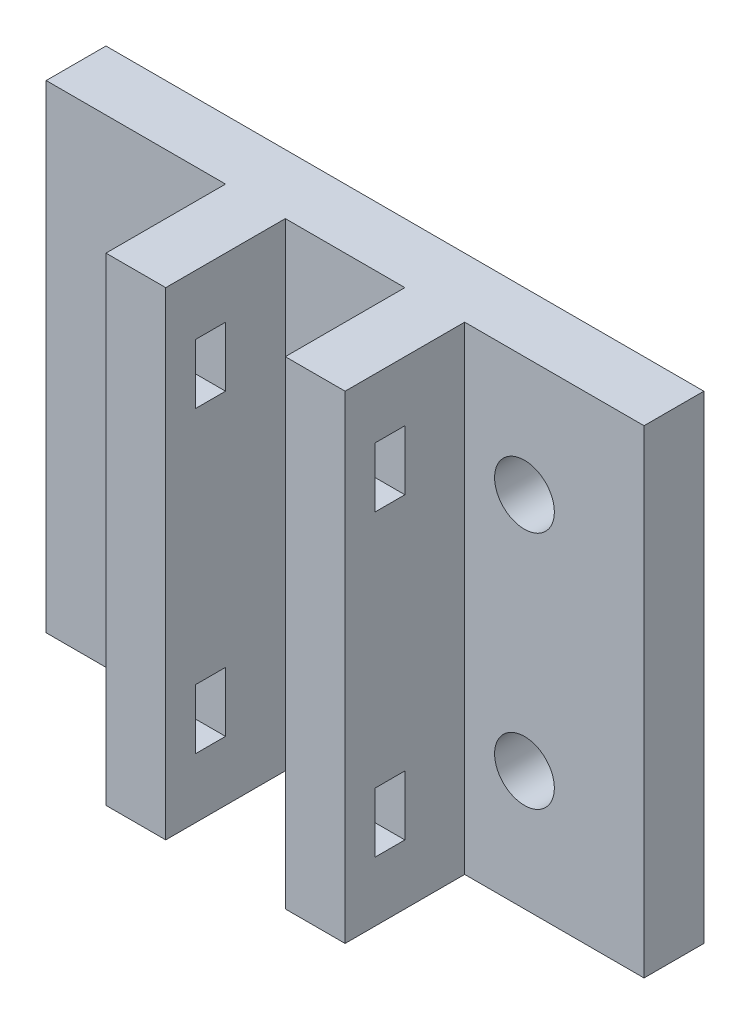
ISO-10303-21;
HEADER;
FILE_DESCRIPTION(('STEP AP214'),'2;1');
FILE_NAME('part.step','',(''),(''),'','','');
FILE_SCHEMA(('AUTOMOTIVE_DESIGN { 1 0 10303 214 1 1 1 1 }'));
ENDSEC;
DATA;
#1=APPLICATION_CONTEXT('core data for automotive mechanical design processes');
#2=APPLICATION_PROTOCOL_DEFINITION('international standard','automotive_design',2000,#1);
#3=PRODUCT_CONTEXT('',#1,'mechanical');
#4=PRODUCT('Part','Part','',(#3));
#5=PRODUCT_RELATED_PRODUCT_CATEGORY('part','',(#4));
#6=PRODUCT_DEFINITION_FORMATION('','',#4);
#7=PRODUCT_DEFINITION_CONTEXT('part definition',#1,'design');
#8=PRODUCT_DEFINITION('design','',#6,#7);
#9=PRODUCT_DEFINITION_SHAPE('','',#8);
#10=(LENGTH_UNIT() NAMED_UNIT(*) SI_UNIT(.MILLI.,.METRE.));
#11=(NAMED_UNIT(*) PLANE_ANGLE_UNIT() SI_UNIT($,.RADIAN.));
#12=(NAMED_UNIT(*) SI_UNIT($,.STERADIAN.) SOLID_ANGLE_UNIT());
#13=UNCERTAINTY_MEASURE_WITH_UNIT(LENGTH_MEASURE(1.E-05),#10,'distance_accuracy_value','');
#14=(GEOMETRIC_REPRESENTATION_CONTEXT(3) GLOBAL_UNCERTAINTY_ASSIGNED_CONTEXT((#13)) GLOBAL_UNIT_ASSIGNED_CONTEXT((#10,
#11,#12)) REPRESENTATION_CONTEXT('',''));
#15=CARTESIAN_POINT('',(0.,0.,0.));
#16=DIRECTION('',(0.,0.,1.));
#17=DIRECTION('',(1.,0.,0.));
#18=AXIS2_PLACEMENT_3D('',#15,#16,#17);
#19=CARTESIAN_POINT('',(0.,0.,5.));
#20=DIRECTION('',(0.,0.,1.));
#21=DIRECTION('',(1.,0.,0.));
#22=AXIS2_PLACEMENT_3D('',#19,#20,#21);
#23=PLANE('',#22);
#24=CARTESIAN_POINT('',(28.5314970420748,417.465305842046,5.));
#25=DIRECTION('',(0.,0.,1.));
#26=DIRECTION('',(1.,0.,0.));
#27=AXIS2_PLACEMENT_3D('',#24,#25,#26);
#28=CIRCLE('',#27,5.);
#29=CARTESIAN_POINT('',(33.5314970420748,417.465305842046,5.));
#30=VERTEX_POINT('',#29);
#31=EDGE_CURVE('E448',#30,#30,#28,.F.);
#32=ORIENTED_EDGE('',*,*,#31,.T.);
#33=EDGE_LOOP('',(#32));
#34=FACE_BOUND('',#33,.T.);
#35=CARTESIAN_POINT('',(28.5314970420748,457.465305842043,5.));
#36=DIRECTION('',(0.,0.,1.));
#37=DIRECTION('',(1.,0.,0.));
#38=AXIS2_PLACEMENT_3D('',#35,#36,#37);
#39=CIRCLE('',#38,5.);
#40=CARTESIAN_POINT('',(33.5314970420748,457.465305842043,5.));
#41=VERTEX_POINT('',#40);
#42=EDGE_CURVE('E444',#41,#41,#39,.F.);
#43=ORIENTED_EDGE('',*,*,#42,.T.);
#44=EDGE_LOOP('',(#43));
#45=FACE_BOUND('',#44,.T.);
#46=DIRECTION('',(-1.,0.,0.));
#47=VECTOR('',#46,1.);
#48=CARTESIAN_POINT('',(-51.4685029579316,477.465305842043,5.));
#49=LINE('',#48,#47);
#50=CARTESIAN_POINT('',(48.5314970420748,477.465305842043,5.));
#51=VERTEX_POINT('',#50);
#52=CARTESIAN_POINT('',(18.5314970420716,477.465305842043,5.));
#53=VERTEX_POINT('',#52);
#54=EDGE_CURVE('E439',#51,#53,#49,.T.);
#55=ORIENTED_EDGE('',*,*,#54,.T.);
#56=DIRECTION('',(0.,1.,0.));
#57=VECTOR('',#56,1.);
#58=CARTESIAN_POINT('',(18.5314970420716,0.,5.));
#59=LINE('',#58,#57);
#60=CARTESIAN_POINT('',(18.5314970420716,397.465305842046,5.));
#61=VERTEX_POINT('',#60);
#62=EDGE_CURVE('E354',#61,#53,#59,.T.);
#63=ORIENTED_EDGE('',*,*,#62,.F.);
#64=DIRECTION('',(1.,0.,0.));
#65=VECTOR('',#64,1.);
#66=CARTESIAN_POINT('',(-51.4685029579316,397.465305842046,5.));
#67=LINE('',#66,#65);
#68=CARTESIAN_POINT('',(48.5314970420748,397.465305842046,5.));
#69=VERTEX_POINT('',#68);
#70=EDGE_CURVE('E430',#61,#69,#67,.T.);
#71=ORIENTED_EDGE('',*,*,#70,.T.);
#72=DIRECTION('',(0.,1.,0.));
#73=VECTOR('',#72,1.);
#74=CARTESIAN_POINT('',(48.5314970420748,477.465305842043,5.));
#75=LINE('',#74,#73);
#76=EDGE_CURVE('E434',#69,#51,#75,.T.);
#77=ORIENTED_EDGE('',*,*,#76,.T.);
#78=EDGE_LOOP('',(#55,#63,#71,#77));
#79=FACE_BOUND('',#78,.T.);
#80=ADVANCED_FACE('F41',(#34,#45,#79),#23,.T.);
#81=DIRECTION('',(0.,1.,0.));
#82=VECTOR('',#81,1.);
#83=CARTESIAN_POINT('',(8.5314970420716,0.,5.));
#84=LINE('',#83,#82);
#85=CARTESIAN_POINT('',(8.53149704207159,397.465305842046,5.));
#86=VERTEX_POINT('',#85);
#87=CARTESIAN_POINT('',(8.53149704207159,477.465305842043,5.));
#88=VERTEX_POINT('',#87);
#89=EDGE_CURVE('E360',#86,#88,#84,.T.);
#90=ORIENTED_EDGE('',*,*,#89,.T.);
#91=CARTESIAN_POINT('',(-11.4685029579284,477.465305842043,5.));
#92=VERTEX_POINT('',#91);
#93=EDGE_CURVE('E443',#88,#92,#49,.T.);
#94=ORIENTED_EDGE('',*,*,#93,.T.);
#95=DIRECTION('',(0.,-1.,0.));
#96=VECTOR('',#95,1.);
#97=CARTESIAN_POINT('',(-11.4685029579284,0.,5.));
#98=LINE('',#97,#96);
#99=CARTESIAN_POINT('',(-11.4685029579284,397.465305842046,5.));
#100=VERTEX_POINT('',#99);
#101=EDGE_CURVE('E391',#92,#100,#98,.T.);
#102=ORIENTED_EDGE('',*,*,#101,.T.);
#103=EDGE_CURVE('E435',#100,#86,#67,.T.);
#104=ORIENTED_EDGE('',*,*,#103,.T.);
#105=EDGE_LOOP('',(#90,#94,#102,#104));
#106=FACE_BOUND('',#105,.T.);
#107=ADVANCED_FACE('F554',(#106),#23,.T.);
#108=CARTESIAN_POINT('',(-51.4685029579253,477.465305842043,15.));
#109=DIRECTION('',(0.,-1.,0.));
#110=DIRECTION('',(0.,0.,-1.));
#111=AXIS2_PLACEMENT_3D('',#108,#109,#110);
#112=PLANE('',#111);
#113=ORIENTED_EDGE('',*,*,#54,.F.);
#114=DIRECTION('',(0.,0.,-1.));
#115=VECTOR('',#114,1.);
#116=CARTESIAN_POINT('',(48.531497042081,477.465305842043,15.));
#117=LINE('',#116,#115);
#118=CARTESIAN_POINT('',(48.531497042081,477.465305842043,-5.));
#119=VERTEX_POINT('',#118);
#120=EDGE_CURVE('E494',#51,#119,#117,.T.);
#121=ORIENTED_EDGE('',*,*,#120,.T.);
#122=DIRECTION('',(-1.,0.,0.));
#123=VECTOR('',#122,1.);
#124=CARTESIAN_POINT('',(-51.4685029579253,477.465305842043,-5.));
#125=LINE('',#124,#123);
#126=CARTESIAN_POINT('',(-51.4685029579316,477.465305842043,-5.));
#127=VERTEX_POINT('',#126);
#128=EDGE_CURVE('E490',#119,#127,#125,.T.);
#129=ORIENTED_EDGE('',*,*,#128,.T.);
#130=DIRECTION('',(0.,0.,-1.));
#131=VECTOR('',#130,1.);
#132=CARTESIAN_POINT('',(-51.4685029579316,477.465305842043,15.));
#133=LINE('',#132,#131);
#134=CARTESIAN_POINT('',(-51.4685029579316,477.465305842043,5.));
#135=VERTEX_POINT('',#134);
#136=EDGE_CURVE('E479',#135,#127,#133,.T.);
#137=ORIENTED_EDGE('',*,*,#136,.F.);
#138=CARTESIAN_POINT('',(-21.4685029579284,477.465305842043,5.));
#139=VERTEX_POINT('',#138);
#140=EDGE_CURVE('E438',#139,#135,#49,.T.);
#141=ORIENTED_EDGE('',*,*,#140,.F.);
#142=DIRECTION('',(0.,0.,-1.));
#143=VECTOR('',#142,1.);
#144=CARTESIAN_POINT('',(-21.4685029579284,477.465305842043,25.));
#145=LINE('',#144,#143);
#146=CARTESIAN_POINT('',(-21.4685029579284,477.465305842043,25.));
#147=VERTEX_POINT('',#146);
#148=EDGE_CURVE('E419',#147,#139,#145,.T.);
#149=ORIENTED_EDGE('',*,*,#148,.F.);
#150=DIRECTION('',(-1.,0.,0.));
#151=VECTOR('',#150,1.);
#152=CARTESIAN_POINT('',(0.,477.465305842043,25.));
#153=LINE('',#152,#151);
#154=CARTESIAN_POINT('',(-11.4685029579284,477.465305842043,25.));
#155=VERTEX_POINT('',#154);
#156=EDGE_CURVE('E396',#155,#147,#153,.T.);
#157=ORIENTED_EDGE('',*,*,#156,.F.);
#158=DIRECTION('',(0.,0.,-1.));
#159=VECTOR('',#158,1.);
#160=CARTESIAN_POINT('',(-11.4685029579284,477.465305842043,25.));
#161=LINE('',#160,#159);
#162=EDGE_CURVE('E423',#155,#92,#161,.T.);
#163=ORIENTED_EDGE('',*,*,#162,.T.);
#164=ORIENTED_EDGE('',*,*,#93,.F.);
#165=DIRECTION('',(0.,0.,-1.));
#166=VECTOR('',#165,1.);
#167=CARTESIAN_POINT('',(8.5314970420716,477.465305842043,25.));
#168=LINE('',#167,#166);
#169=CARTESIAN_POINT('',(8.5314970420716,477.465305842043,25.));
#170=VERTEX_POINT('',#169);
#171=EDGE_CURVE('E379',#170,#88,#168,.T.);
#172=ORIENTED_EDGE('',*,*,#171,.F.);
#173=DIRECTION('',(-1.,0.,0.));
#174=VECTOR('',#173,1.);
#175=CARTESIAN_POINT('',(0.,477.465305842043,25.));
#176=LINE('',#175,#174);
#177=CARTESIAN_POINT('',(18.5314970420716,477.465305842043,25.));
#178=VERTEX_POINT('',#177);
#179=EDGE_CURVE('E363',#178,#170,#176,.T.);
#180=ORIENTED_EDGE('',*,*,#179,.F.);
#181=DIRECTION('',(0.,0.,-1.));
#182=VECTOR('',#181,1.);
#183=CARTESIAN_POINT('',(18.5314970420716,477.465305842043,25.));
#184=LINE('',#183,#182);
#185=EDGE_CURVE('E383',#178,#53,#184,.T.);
#186=ORIENTED_EDGE('',*,*,#185,.T.);
#187=EDGE_LOOP('',(#113,#121,#129,#137,#141,#149,#157,#163,#164,#172,#180,#186));
#188=FACE_BOUND('',#187,.T.);
#189=ADVANCED_FACE('F562',(#188),#112,.F.);
#190=CARTESIAN_POINT('',(-51.4685029579316,477.465305842043,15.));
#191=DIRECTION('',(-1.,0.,0.));
#192=DIRECTION('',(0.,-1.,0.));
#193=AXIS2_PLACEMENT_3D('',#190,#191,#192);
#194=PLANE('',#193);
#195=DIRECTION('',(0.,0.,-1.));
#196=VECTOR('',#195,1.);
#197=CARTESIAN_POINT('',(-51.4685029579254,397.465305842046,15.));
#198=LINE('',#197,#196);
#199=CARTESIAN_POINT('',(-51.4685029579316,397.465305842046,5.));
#200=VERTEX_POINT('',#199);
#201=CARTESIAN_POINT('',(-51.4685029579254,397.465305842046,-5.));
#202=VERTEX_POINT('',#201);
#203=EDGE_CURVE('E476',#200,#202,#198,.T.);
#204=ORIENTED_EDGE('',*,*,#203,.F.);
#205=DIRECTION('',(0.,-1.,0.));
#206=VECTOR('',#205,1.);
#207=CARTESIAN_POINT('',(-51.4685029579316,477.465305842043,5.));
#208=LINE('',#207,#206);
#209=EDGE_CURVE('E427',#135,#200,#208,.T.);
#210=ORIENTED_EDGE('',*,*,#209,.F.);
#211=ORIENTED_EDGE('',*,*,#136,.T.);
#212=DIRECTION('',(0.,1.,0.));
#213=VECTOR('',#212,1.);
#214=CARTESIAN_POINT('',(-51.4685029579316,477.465305842043,-5.));
#215=LINE('',#214,#213);
#216=EDGE_CURVE('E472',#202,#127,#215,.T.);
#217=ORIENTED_EDGE('',*,*,#216,.F.);
#218=EDGE_LOOP('',(#204,#210,#211,#217));
#219=FACE_BOUND('',#218,.T.);
#220=ADVANCED_FACE('F599',(#219),#194,.T.);
#221=CARTESIAN_POINT('',(-51.4685029579253,397.465305842046,15.));
#222=DIRECTION('',(0.,1.,0.));
#223=DIRECTION('',(0.,0.,1.));
#224=AXIS2_PLACEMENT_3D('',#221,#222,#223);
#225=PLANE('',#224);
#226=CARTESIAN_POINT('',(-21.4685029579284,397.465305842046,5.));
#227=VERTEX_POINT('',#226);
#228=EDGE_CURVE('E431',#200,#227,#67,.T.);
#229=ORIENTED_EDGE('',*,*,#228,.F.);
#230=ORIENTED_EDGE('',*,*,#203,.T.);
#231=DIRECTION('',(1.,0.,0.));
#232=VECTOR('',#231,1.);
#233=CARTESIAN_POINT('',(-51.4685029579253,397.465305842046,-5.));
#234=LINE('',#233,#232);
#235=CARTESIAN_POINT('',(48.5314970420748,397.465305842046,-5.));
#236=VERTEX_POINT('',#235);
#237=EDGE_CURVE('E482',#202,#236,#234,.T.);
#238=ORIENTED_EDGE('',*,*,#237,.T.);
#239=DIRECTION('',(0.,0.,-1.));
#240=VECTOR('',#239,1.);
#241=CARTESIAN_POINT('',(48.5314970420748,397.465305842046,15.));
#242=LINE('',#241,#240);
#243=EDGE_CURVE('E497',#69,#236,#242,.T.);
#244=ORIENTED_EDGE('',*,*,#243,.F.);
#245=ORIENTED_EDGE('',*,*,#70,.F.);
#246=DIRECTION('',(0.,0.,-1.));
#247=VECTOR('',#246,1.);
#248=CARTESIAN_POINT('',(18.5314970420716,397.465305842046,25.));
#249=LINE('',#248,#247);
#250=CARTESIAN_POINT('',(18.5314970420716,397.465305842046,25.));
#251=VERTEX_POINT('',#250);
#252=EDGE_CURVE('E387',#251,#61,#249,.T.);
#253=ORIENTED_EDGE('',*,*,#252,.F.);
#254=DIRECTION('',(1.,0.,0.));
#255=VECTOR('',#254,1.);
#256=CARTESIAN_POINT('',(0.,397.465305842046,25.));
#257=LINE('',#256,#255);
#258=CARTESIAN_POINT('',(8.5314970420716,397.465305842046,25.));
#259=VERTEX_POINT('',#258);
#260=EDGE_CURVE('E355',#259,#251,#257,.T.);
#261=ORIENTED_EDGE('',*,*,#260,.F.);
#262=DIRECTION('',(0.,0.,-1.));
#263=VECTOR('',#262,1.);
#264=CARTESIAN_POINT('',(8.5314970420716,397.465305842046,25.));
#265=LINE('',#264,#263);
#266=EDGE_CURVE('E370',#259,#86,#265,.T.);
#267=ORIENTED_EDGE('',*,*,#266,.T.);
#268=ORIENTED_EDGE('',*,*,#103,.F.);
#269=DIRECTION('',(0.,0.,-1.));
#270=VECTOR('',#269,1.);
#271=CARTESIAN_POINT('',(-11.4685029579284,397.465305842046,25.));
#272=LINE('',#271,#270);
#273=CARTESIAN_POINT('',(-11.4685029579284,397.465305842046,25.));
#274=VERTEX_POINT('',#273);
#275=EDGE_CURVE('E406',#274,#100,#272,.T.);
#276=ORIENTED_EDGE('',*,*,#275,.F.);
#277=DIRECTION('',(1.,0.,0.));
#278=VECTOR('',#277,1.);
#279=CARTESIAN_POINT('',(0.,397.465305842046,25.));
#280=LINE('',#279,#278);
#281=CARTESIAN_POINT('',(-21.4685029579284,397.465305842046,25.));
#282=VERTEX_POINT('',#281);
#283=EDGE_CURVE('E403',#282,#274,#280,.T.);
#284=ORIENTED_EDGE('',*,*,#283,.F.);
#285=DIRECTION('',(0.,0.,-1.));
#286=VECTOR('',#285,1.);
#287=CARTESIAN_POINT('',(-21.4685029579284,397.465305842046,25.));
#288=LINE('',#287,#286);
#289=EDGE_CURVE('E415',#282,#227,#288,.T.);
#290=ORIENTED_EDGE('',*,*,#289,.T.);
#291=EDGE_LOOP('',(#229,#230,#238,#244,#245,#253,#261,#267,#268,#276,#284,#290));
#292=FACE_BOUND('',#291,.T.);
#293=ADVANCED_FACE('F43',(#292),#225,.F.);
#294=CARTESIAN_POINT('',(48.531497042081,477.465305842043,15.));
#295=DIRECTION('',(-1.,0.,0.));
#296=DIRECTION('',(0.,-1.,0.));
#297=AXIS2_PLACEMENT_3D('',#294,#295,#296);
#298=PLANE('',#297);
#299=ORIENTED_EDGE('',*,*,#76,.F.);
#300=ORIENTED_EDGE('',*,*,#243,.T.);
#301=DIRECTION('',(0.,1.,0.));
#302=VECTOR('',#301,1.);
#303=CARTESIAN_POINT('',(48.531497042081,477.465305842043,-5.));
#304=LINE('',#303,#302);
#305=EDGE_CURVE('E486',#236,#119,#304,.T.);
#306=ORIENTED_EDGE('',*,*,#305,.T.);
#307=ORIENTED_EDGE('',*,*,#120,.F.);
#308=EDGE_LOOP('',(#299,#300,#306,#307));
#309=FACE_BOUND('',#308,.T.);
#310=ADVANCED_FACE('F586',(#309),#298,.F.);
#311=CARTESIAN_POINT('',(-31.4685029579254,457.465305842043,-5.));
#312=DIRECTION('',(0.,0.,1.));
#313=DIRECTION('',(1.,0.,0.));
#314=AXIS2_PLACEMENT_3D('',#311,#312,#313);
#315=CYLINDRICAL_SURFACE('',#314,5.);
#316=CARTESIAN_POINT('',(-31.4685029579254,457.465305842043,-5.));
#317=DIRECTION('',(0.,0.,1.));
#318=DIRECTION('',(1.,0.,0.));
#319=AXIS2_PLACEMENT_3D('',#316,#317,#318);
#320=CIRCLE('',#319,5.);
#321=CARTESIAN_POINT('',(-26.4685029579254,457.465305842043,-5.));
#322=VERTEX_POINT('',#321);
#323=EDGE_CURVE('E465',#322,#322,#320,.T.);
#324=ORIENTED_EDGE('',*,*,#323,.F.);
#325=EDGE_LOOP('',(#324));
#326=FACE_BOUND('',#325,.T.);
#327=CARTESIAN_POINT('',(-31.4685029579254,457.465305842043,5.));
#328=DIRECTION('',(0.,0.,1.));
#329=DIRECTION('',(1.,0.,0.));
#330=AXIS2_PLACEMENT_3D('',#327,#328,#329);
#331=CIRCLE('',#330,5.);
#332=CARTESIAN_POINT('',(-26.4685029579254,457.465305842043,5.));
#333=VERTEX_POINT('',#332);
#334=EDGE_CURVE('E452',#333,#333,#331,.F.);
#335=ORIENTED_EDGE('',*,*,#334,.F.);
#336=EDGE_LOOP('',(#335));
#337=FACE_BOUND('',#336,.T.);
#338=ADVANCED_FACE('F647',(#326,#337),#315,.F.);
#339=CARTESIAN_POINT('',(28.5314970420748,417.465305842046,-5.));
#340=DIRECTION('',(0.,0.,1.));
#341=DIRECTION('',(1.,0.,0.));
#342=AXIS2_PLACEMENT_3D('',#339,#340,#341);
#343=CYLINDRICAL_SURFACE('',#342,5.);
#344=CARTESIAN_POINT('',(28.5314970420748,417.465305842046,-5.));
#345=DIRECTION('',(0.,0.,1.));
#346=DIRECTION('',(1.,0.,0.));
#347=AXIS2_PLACEMENT_3D('',#344,#345,#346);
#348=CIRCLE('',#347,5.);
#349=CARTESIAN_POINT('',(33.5314970420748,417.465305842046,-5.));
#350=VERTEX_POINT('',#349);
#351=EDGE_CURVE('E456',#350,#350,#348,.T.);
#352=ORIENTED_EDGE('',*,*,#351,.F.);
#353=EDGE_LOOP('',(#352));
#354=FACE_BOUND('',#353,.T.);
#355=ORIENTED_EDGE('',*,*,#31,.F.);
#356=EDGE_LOOP('',(#355));
#357=FACE_BOUND('',#356,.T.);
#358=ADVANCED_FACE('F652',(#354,#357),#343,.F.);
#359=CARTESIAN_POINT('',(28.5314970420748,457.465305842043,-5.));
#360=DIRECTION('',(0.,0.,1.));
#361=DIRECTION('',(1.,0.,0.));
#362=AXIS2_PLACEMENT_3D('',#359,#360,#361);
#363=CYLINDRICAL_SURFACE('',#362,5.);
#364=CARTESIAN_POINT('',(28.5314970420748,457.465305842043,-5.));
#365=DIRECTION('',(0.,0.,1.));
#366=DIRECTION('',(1.,0.,0.));
#367=AXIS2_PLACEMENT_3D('',#364,#365,#366);
#368=CIRCLE('',#367,5.);
#369=CARTESIAN_POINT('',(33.5314970420748,457.465305842043,-5.));
#370=VERTEX_POINT('',#369);
#371=EDGE_CURVE('E460',#370,#370,#368,.T.);
#372=ORIENTED_EDGE('',*,*,#371,.F.);
#373=EDGE_LOOP('',(#372));
#374=FACE_BOUND('',#373,.T.);
#375=ORIENTED_EDGE('',*,*,#42,.F.);
#376=EDGE_LOOP('',(#375));
#377=FACE_BOUND('',#376,.T.);
#378=ADVANCED_FACE('F638',(#374,#377),#363,.F.);
#379=CARTESIAN_POINT('',(-31.4685029579254,417.465305842046,-5.));
#380=DIRECTION('',(0.,0.,1.));
#381=DIRECTION('',(1.,0.,0.));
#382=AXIS2_PLACEMENT_3D('',#379,#380,#381);
#383=CYLINDRICAL_SURFACE('',#382,5.);
#384=CARTESIAN_POINT('',(-31.4685029579254,417.465305842046,-5.));
#385=DIRECTION('',(0.,0.,1.));
#386=DIRECTION('',(1.,0.,0.));
#387=AXIS2_PLACEMENT_3D('',#384,#385,#386);
#388=CIRCLE('',#387,5.);
#389=CARTESIAN_POINT('',(-26.4685029579254,417.465305842046,-5.));
#390=VERTEX_POINT('',#389);
#391=EDGE_CURVE('E461',#390,#390,#388,.T.);
#392=ORIENTED_EDGE('',*,*,#391,.F.);
#393=EDGE_LOOP('',(#392));
#394=FACE_BOUND('',#393,.T.);
#395=CARTESIAN_POINT('',(-31.4685029579254,417.465305842046,5.));
#396=DIRECTION('',(0.,0.,1.));
#397=DIRECTION('',(1.,0.,0.));
#398=AXIS2_PLACEMENT_3D('',#395,#396,#397);
#399=CIRCLE('',#398,5.);
#400=CARTESIAN_POINT('',(-26.4685029579254,417.465305842046,5.));
#401=VERTEX_POINT('',#400);
#402=EDGE_CURVE('E442',#401,#401,#399,.F.);
#403=ORIENTED_EDGE('',*,*,#402,.F.);
#404=EDGE_LOOP('',(#403));
#405=FACE_BOUND('',#404,.T.);
#406=ADVANCED_FACE('F632',(#394,#405),#383,.F.);
#407=CARTESIAN_POINT('',(1.46850295792541,-437.810556226923,-5.));
#408=DIRECTION('',(0.,0.,1.));
#409=DIRECTION('',(1.,0.,0.));
#410=AXIS2_PLACEMENT_3D('',#407,#408,#409);
#411=PLANE('',#410);
#412=ORIENTED_EDGE('',*,*,#391,.T.);
#413=EDGE_LOOP('',(#412));
#414=FACE_BOUND('',#413,.T.);
#415=ORIENTED_EDGE('',*,*,#371,.T.);
#416=EDGE_LOOP('',(#415));
#417=FACE_BOUND('',#416,.T.);
#418=ORIENTED_EDGE('',*,*,#351,.T.);
#419=EDGE_LOOP('',(#418));
#420=FACE_BOUND('',#419,.T.);
#421=ORIENTED_EDGE('',*,*,#323,.T.);
#422=EDGE_LOOP('',(#421));
#423=FACE_BOUND('',#422,.T.);
#424=ORIENTED_EDGE('',*,*,#237,.F.);
#425=ORIENTED_EDGE('',*,*,#216,.T.);
#426=ORIENTED_EDGE('',*,*,#128,.F.);
#427=ORIENTED_EDGE('',*,*,#305,.F.);
#428=EDGE_LOOP('',(#424,#425,#426,#427));
#429=FACE_BOUND('',#428,.T.);
#430=ADVANCED_FACE('F592',(#414,#417,#420,#423,#429),#411,.F.);
#431=DIRECTION('',(0.,-1.,0.));
#432=VECTOR('',#431,1.);
#433=CARTESIAN_POINT('',(-21.4685029579283,0.,5.));
#434=LINE('',#433,#432);
#435=EDGE_CURVE('E397',#139,#227,#434,.T.);
#436=ORIENTED_EDGE('',*,*,#435,.F.);
#437=ORIENTED_EDGE('',*,*,#140,.T.);
#438=ORIENTED_EDGE('',*,*,#209,.T.);
#439=ORIENTED_EDGE('',*,*,#228,.T.);
#440=EDGE_LOOP('',(#436,#437,#438,#439));
#441=FACE_BOUND('',#440,.T.);
#442=ORIENTED_EDGE('',*,*,#402,.T.);
#443=EDGE_LOOP('',(#442));
#444=FACE_BOUND('',#443,.T.);
#445=ORIENTED_EDGE('',*,*,#334,.T.);
#446=EDGE_LOOP('',(#445));
#447=FACE_BOUND('',#446,.T.);
#448=ADVANCED_FACE('F601',(#441,#444,#447),#23,.T.);
#449=CARTESIAN_POINT('',(-11.4685029579284,0.,25.));
#450=DIRECTION('',(1.,0.,0.));
#451=DIRECTION('',(0.,0.,-1.));
#452=AXIS2_PLACEMENT_3D('',#449,#450,#451);
#453=PLANE('',#452);
#454=DIRECTION('',(0.,-1.,0.));
#455=VECTOR('',#454,1.);
#456=CARTESIAN_POINT('',(-11.4685029579284,0.,20.));
#457=LINE('',#456,#455);
#458=CARTESIAN_POINT('',(-11.4685029579284,467.465305842043,20.));
#459=VERTEX_POINT('',#458);
#460=CARTESIAN_POINT('',(-11.4685029579284,457.465305842043,20.));
#461=VERTEX_POINT('',#460);
#462=EDGE_CURVE('E351',#459,#461,#457,.T.);
#463=ORIENTED_EDGE('',*,*,#462,.F.);
#464=DIRECTION('',(0.,0.,1.));
#465=VECTOR('',#464,1.);
#466=CARTESIAN_POINT('',(-11.4685029579284,467.465305842043,25.));
#467=LINE('',#466,#465);
#468=CARTESIAN_POINT('',(-11.4685029579284,467.465305842043,15.));
#469=VERTEX_POINT('',#468);
#470=EDGE_CURVE('E331',#469,#459,#467,.T.);
#471=ORIENTED_EDGE('',*,*,#470,.F.);
#472=DIRECTION('',(0.,1.,0.));
#473=VECTOR('',#472,1.);
#474=CARTESIAN_POINT('',(-11.4685029579284,0.,15.0000000000001));
#475=LINE('',#474,#473);
#476=CARTESIAN_POINT('',(-11.4685029579284,457.465305842043,15.));
#477=VERTEX_POINT('',#476);
#478=EDGE_CURVE('E232',#477,#469,#475,.T.);
#479=ORIENTED_EDGE('',*,*,#478,.F.);
#480=DIRECTION('',(0.,0.,-1.));
#481=VECTOR('',#480,1.);
#482=CARTESIAN_POINT('',(-11.4685029579284,457.465305842043,25.));
#483=LINE('',#482,#481);
#484=EDGE_CURVE('E344',#461,#477,#483,.T.);
#485=ORIENTED_EDGE('',*,*,#484,.F.);
#486=EDGE_LOOP('',(#463,#471,#479,#485));
#487=FACE_BOUND('',#486,.T.);
#488=DIRECTION('',(0.,-1.,0.));
#489=VECTOR('',#488,1.);
#490=CARTESIAN_POINT('',(-11.4685029579284,0.,20.));
#491=LINE('',#490,#489);
#492=CARTESIAN_POINT('',(-11.4685029579284,417.465305842046,20.));
#493=VERTEX_POINT('',#492);
#494=CARTESIAN_POINT('',(-11.4685029579284,407.465305842046,20.));
#495=VERTEX_POINT('',#494);
#496=EDGE_CURVE('E324',#493,#495,#491,.T.);
#497=ORIENTED_EDGE('',*,*,#496,.F.);
#498=DIRECTION('',(0.,0.,1.));
#499=VECTOR('',#498,1.);
#500=CARTESIAN_POINT('',(-11.4685029579284,417.465305842046,25.));
#501=LINE('',#500,#499);
#502=CARTESIAN_POINT('',(-11.4685029579284,417.465305842046,15.));
#503=VERTEX_POINT('',#502);
#504=EDGE_CURVE('E303',#503,#493,#501,.T.);
#505=ORIENTED_EDGE('',*,*,#504,.F.);
#506=DIRECTION('',(0.,1.,0.));
#507=VECTOR('',#506,1.);
#508=CARTESIAN_POINT('',(-11.4685029579284,0.,15.));
#509=LINE('',#508,#507);
#510=CARTESIAN_POINT('',(-11.4685029579284,407.465305842046,15.));
#511=VERTEX_POINT('',#510);
#512=EDGE_CURVE('E310',#511,#503,#509,.T.);
#513=ORIENTED_EDGE('',*,*,#512,.F.);
#514=DIRECTION('',(0.,0.,-1.));
#515=VECTOR('',#514,1.);
#516=CARTESIAN_POINT('',(-11.4685029579284,407.465305842046,25.));
#517=LINE('',#516,#515);
#518=EDGE_CURVE('E317',#495,#511,#517,.T.);
#519=ORIENTED_EDGE('',*,*,#518,.F.);
#520=EDGE_LOOP('',(#497,#505,#513,#519));
#521=FACE_BOUND('',#520,.T.);
#522=ORIENTED_EDGE('',*,*,#101,.F.);
#523=ORIENTED_EDGE('',*,*,#162,.F.);
#524=DIRECTION('',(0.,-1.,0.));
#525=VECTOR('',#524,1.);
#526=CARTESIAN_POINT('',(-11.4685029579284,0.,25.));
#527=LINE('',#526,#525);
#528=EDGE_CURVE('E392',#155,#274,#527,.T.);
#529=ORIENTED_EDGE('',*,*,#528,.T.);
#530=ORIENTED_EDGE('',*,*,#275,.T.);
#531=EDGE_LOOP('',(#522,#523,#529,#530));
#532=FACE_BOUND('',#531,.T.);
#533=ADVANCED_FACE('F566',(#487,#521,#532),#453,.T.);
#534=CARTESIAN_POINT('',(-21.4685029579283,0.,25.));
#535=DIRECTION('',(1.,0.,0.));
#536=DIRECTION('',(0.,1.,0.));
#537=AXIS2_PLACEMENT_3D('',#534,#535,#536);
#538=PLANE('',#537);
#539=DIRECTION('',(0.,0.,-1.));
#540=VECTOR('',#539,1.);
#541=CARTESIAN_POINT('',(-21.4685029579284,467.465305842043,20.));
#542=LINE('',#541,#540);
#543=CARTESIAN_POINT('',(-21.4685029579284,467.465305842043,20.));
#544=VERTEX_POINT('',#543);
#545=CARTESIAN_POINT('',(-21.4685029579284,467.465305842043,15.));
#546=VERTEX_POINT('',#545);
#547=EDGE_CURVE('E240',#544,#546,#542,.T.);
#548=ORIENTED_EDGE('',*,*,#547,.F.);
#549=DIRECTION('',(0.,1.,0.));
#550=VECTOR('',#549,1.);
#551=CARTESIAN_POINT('',(-21.4685029579284,467.465305842043,20.));
#552=LINE('',#551,#550);
#553=CARTESIAN_POINT('',(-21.4685029579284,457.465305842043,20.));
#554=VERTEX_POINT('',#553);
#555=EDGE_CURVE('E247',#554,#544,#552,.T.);
#556=ORIENTED_EDGE('',*,*,#555,.F.);
#557=DIRECTION('',(0.,0.,1.));
#558=VECTOR('',#557,1.);
#559=CARTESIAN_POINT('',(-21.4685029579284,457.465305842043,20.));
#560=LINE('',#559,#558);
#561=CARTESIAN_POINT('',(-21.4685029579284,457.465305842043,15.));
#562=VERTEX_POINT('',#561);
#563=EDGE_CURVE('E252',#562,#554,#560,.T.);
#564=ORIENTED_EDGE('',*,*,#563,.F.);
#565=DIRECTION('',(0.,-1.,0.));
#566=VECTOR('',#565,1.);
#567=CARTESIAN_POINT('',(-21.4685029579284,467.465305842043,15.));
#568=LINE('',#567,#566);
#569=EDGE_CURVE('E229',#546,#562,#568,.T.);
#570=ORIENTED_EDGE('',*,*,#569,.F.);
#571=EDGE_LOOP('',(#548,#556,#564,#570));
#572=FACE_BOUND('',#571,.T.);
#573=DIRECTION('',(0.,0.,-1.));
#574=VECTOR('',#573,1.);
#575=CARTESIAN_POINT('',(-21.4685029579284,417.465305842046,20.));
#576=LINE('',#575,#574);
#577=CARTESIAN_POINT('',(-21.4685029579284,417.465305842046,20.));
#578=VERTEX_POINT('',#577);
#579=CARTESIAN_POINT('',(-21.4685029579284,417.465305842046,15.));
#580=VERTEX_POINT('',#579);
#581=EDGE_CURVE('E272',#578,#580,#576,.T.);
#582=ORIENTED_EDGE('',*,*,#581,.F.);
#583=DIRECTION('',(0.,1.,0.));
#584=VECTOR('',#583,1.);
#585=CARTESIAN_POINT('',(-21.4685029579284,417.465305842046,20.));
#586=LINE('',#585,#584);
#587=CARTESIAN_POINT('',(-21.4685029579284,407.465305842046,20.));
#588=VERTEX_POINT('',#587);
#589=EDGE_CURVE('E269',#588,#578,#586,.T.);
#590=ORIENTED_EDGE('',*,*,#589,.F.);
#591=DIRECTION('',(0.,0.,1.));
#592=VECTOR('',#591,1.);
#593=CARTESIAN_POINT('',(-21.4685029579284,407.465305842046,20.));
#594=LINE('',#593,#592);
#595=CARTESIAN_POINT('',(-21.4685029579284,407.465305842046,15.));
#596=VERTEX_POINT('',#595);
#597=EDGE_CURVE('E279',#596,#588,#594,.T.);
#598=ORIENTED_EDGE('',*,*,#597,.F.);
#599=DIRECTION('',(0.,-1.,0.));
#600=VECTOR('',#599,1.);
#601=CARTESIAN_POINT('',(-21.4685029579284,417.465305842046,15.));
#602=LINE('',#601,#600);
#603=EDGE_CURVE('E275',#580,#596,#602,.T.);
#604=ORIENTED_EDGE('',*,*,#603,.F.);
#605=EDGE_LOOP('',(#582,#590,#598,#604));
#606=FACE_BOUND('',#605,.T.);
#607=ORIENTED_EDGE('',*,*,#435,.T.);
#608=ORIENTED_EDGE('',*,*,#289,.F.);
#609=DIRECTION('',(0.,-1.,0.));
#610=VECTOR('',#609,1.);
#611=CARTESIAN_POINT('',(-21.4685029579283,0.,25.));
#612=LINE('',#611,#610);
#613=EDGE_CURVE('E400',#147,#282,#612,.T.);
#614=ORIENTED_EDGE('',*,*,#613,.F.);
#615=ORIENTED_EDGE('',*,*,#148,.T.);
#616=EDGE_LOOP('',(#607,#608,#614,#615));
#617=FACE_BOUND('',#616,.T.);
#618=ADVANCED_FACE('F249',(#572,#606,#617),#538,.F.);
#619=CARTESIAN_POINT('',(0.,0.,25.));
#620=DIRECTION('',(0.,0.,1.));
#621=DIRECTION('',(1.,0.,0.));
#622=AXIS2_PLACEMENT_3D('',#619,#620,#621);
#623=PLANE('',#622);
#624=ORIENTED_EDGE('',*,*,#528,.F.);
#625=ORIENTED_EDGE('',*,*,#156,.T.);
#626=ORIENTED_EDGE('',*,*,#613,.T.);
#627=ORIENTED_EDGE('',*,*,#283,.T.);
#628=EDGE_LOOP('',(#624,#625,#626,#627));
#629=FACE_BOUND('',#628,.T.);
#630=ADVANCED_FACE('F607',(#629),#623,.T.);
#631=CARTESIAN_POINT('',(18.5314970420716,0.,25.));
#632=DIRECTION('',(-1.,0.,0.));
#633=DIRECTION('',(0.,0.,1.));
#634=AXIS2_PLACEMENT_3D('',#631,#632,#633);
#635=PLANE('',#634);
#636=DIRECTION('',(0.,0.,1.));
#637=VECTOR('',#636,1.);
#638=CARTESIAN_POINT('',(18.5314970420716,457.465305842043,25.));
#639=LINE('',#638,#637);
#640=CARTESIAN_POINT('',(18.5314970420716,457.465305842043,15.));
#641=VERTEX_POINT('',#640);
#642=CARTESIAN_POINT('',(18.5314970420716,457.465305842043,20.));
#643=VERTEX_POINT('',#642);
#644=EDGE_CURVE('E340',#641,#643,#639,.T.);
#645=ORIENTED_EDGE('',*,*,#644,.T.);
#646=DIRECTION('',(0.,1.,0.));
#647=VECTOR('',#646,1.);
#648=CARTESIAN_POINT('',(18.5314970420716,0.,20.));
#649=LINE('',#648,#647);
#650=CARTESIAN_POINT('',(18.5314970420716,467.465305842043,20.));
#651=VERTEX_POINT('',#650);
#652=EDGE_CURVE('E347',#643,#651,#649,.T.);
#653=ORIENTED_EDGE('',*,*,#652,.T.);
#654=DIRECTION('',(0.,0.,-1.));
#655=VECTOR('',#654,1.);
#656=CARTESIAN_POINT('',(18.5314970420716,467.465305842043,25.));
#657=LINE('',#656,#655);
#658=CARTESIAN_POINT('',(18.5314970420716,467.465305842043,15.));
#659=VERTEX_POINT('',#658);
#660=EDGE_CURVE('E327',#651,#659,#657,.T.);
#661=ORIENTED_EDGE('',*,*,#660,.T.);
#662=DIRECTION('',(0.,-1.,0.));
#663=VECTOR('',#662,1.);
#664=CARTESIAN_POINT('',(18.5314970420716,0.,15.0000000000001));
#665=LINE('',#664,#663);
#666=EDGE_CURVE('E334',#659,#641,#665,.T.);
#667=ORIENTED_EDGE('',*,*,#666,.T.);
#668=EDGE_LOOP('',(#645,#653,#661,#667));
#669=FACE_BOUND('',#668,.T.);
#670=DIRECTION('',(0.,0.,1.));
#671=VECTOR('',#670,1.);
#672=CARTESIAN_POINT('',(18.5314970420716,407.465305842046,25.));
#673=LINE('',#672,#671);
#674=CARTESIAN_POINT('',(18.5314970420716,407.465305842046,15.));
#675=VERTEX_POINT('',#674);
#676=CARTESIAN_POINT('',(18.5314970420716,407.465305842046,20.));
#677=VERTEX_POINT('',#676);
#678=EDGE_CURVE('E313',#675,#677,#673,.T.);
#679=ORIENTED_EDGE('',*,*,#678,.T.);
#680=DIRECTION('',(0.,1.,0.));
#681=VECTOR('',#680,1.);
#682=CARTESIAN_POINT('',(18.5314970420716,0.,20.));
#683=LINE('',#682,#681);
#684=CARTESIAN_POINT('',(18.5314970420716,417.465305842046,20.));
#685=VERTEX_POINT('',#684);
#686=EDGE_CURVE('E320',#677,#685,#683,.T.);
#687=ORIENTED_EDGE('',*,*,#686,.T.);
#688=DIRECTION('',(0.,0.,-1.));
#689=VECTOR('',#688,1.);
#690=CARTESIAN_POINT('',(18.5314970420716,417.465305842046,25.));
#691=LINE('',#690,#689);
#692=CARTESIAN_POINT('',(18.5314970420716,417.465305842046,15.));
#693=VERTEX_POINT('',#692);
#694=EDGE_CURVE('E299',#685,#693,#691,.T.);
#695=ORIENTED_EDGE('',*,*,#694,.T.);
#696=DIRECTION('',(0.,-1.,0.));
#697=VECTOR('',#696,1.);
#698=CARTESIAN_POINT('',(18.5314970420716,0.,15.));
#699=LINE('',#698,#697);
#700=EDGE_CURVE('E306',#693,#675,#699,.T.);
#701=ORIENTED_EDGE('',*,*,#700,.T.);
#702=EDGE_LOOP('',(#679,#687,#695,#701));
#703=FACE_BOUND('',#702,.T.);
#704=ORIENTED_EDGE('',*,*,#62,.T.);
#705=ORIENTED_EDGE('',*,*,#185,.F.);
#706=DIRECTION('',(0.,1.,0.));
#707=VECTOR('',#706,1.);
#708=CARTESIAN_POINT('',(18.5314970420716,0.,25.));
#709=LINE('',#708,#707);
#710=EDGE_CURVE('E359',#251,#178,#709,.T.);
#711=ORIENTED_EDGE('',*,*,#710,.F.);
#712=ORIENTED_EDGE('',*,*,#252,.T.);
#713=EDGE_LOOP('',(#704,#705,#711,#712));
#714=FACE_BOUND('',#713,.T.);
#715=ADVANCED_FACE('F580',(#669,#703,#714),#635,.F.);
#716=CARTESIAN_POINT('',(8.5314970420716,0.,25.));
#717=DIRECTION('',(-1.,0.,0.));
#718=DIRECTION('',(0.,0.,1.));
#719=AXIS2_PLACEMENT_3D('',#716,#717,#718);
#720=PLANE('',#719);
#721=DIRECTION('',(0.,1.,0.));
#722=VECTOR('',#721,1.);
#723=CARTESIAN_POINT('',(8.5314970420716,0.,20.));
#724=LINE('',#723,#722);
#725=CARTESIAN_POINT('',(8.5314970420716,457.465305842043,20.));
#726=VERTEX_POINT('',#725);
#727=CARTESIAN_POINT('',(8.5314970420716,467.465305842043,20.));
#728=VERTEX_POINT('',#727);
#729=EDGE_CURVE('E11',#726,#728,#724,.T.);
#730=ORIENTED_EDGE('',*,*,#729,.F.);
#731=DIRECTION('',(0.,0.,1.));
#732=VECTOR('',#731,1.);
#733=CARTESIAN_POINT('',(8.5314970420716,457.465305842043,25.));
#734=LINE('',#733,#732);
#735=CARTESIAN_POINT('',(8.5314970420716,457.465305842043,15.));
#736=VERTEX_POINT('',#735);
#737=EDGE_CURVE('E50',#736,#726,#734,.T.);
#738=ORIENTED_EDGE('',*,*,#737,.F.);
#739=DIRECTION('',(0.,-1.,0.));
#740=VECTOR('',#739,1.);
#741=CARTESIAN_POINT('',(8.5314970420716,0.,15.0000000000001));
#742=LINE('',#741,#740);
#743=CARTESIAN_POINT('',(8.5314970420716,467.465305842043,15.));
#744=VERTEX_POINT('',#743);
#745=EDGE_CURVE('E519',#744,#736,#742,.T.);
#746=ORIENTED_EDGE('',*,*,#745,.F.);
#747=DIRECTION('',(0.,0.,-1.));
#748=VECTOR('',#747,1.);
#749=CARTESIAN_POINT('',(8.5314970420716,467.465305842043,25.));
#750=LINE('',#749,#748);
#751=EDGE_CURVE('E516',#728,#744,#750,.T.);
#752=ORIENTED_EDGE('',*,*,#751,.F.);
#753=EDGE_LOOP('',(#730,#738,#746,#752));
#754=FACE_BOUND('',#753,.T.);
#755=DIRECTION('',(0.,1.,0.));
#756=VECTOR('',#755,1.);
#757=CARTESIAN_POINT('',(8.5314970420716,0.,20.));
#758=LINE('',#757,#756);
#759=CARTESIAN_POINT('',(8.5314970420716,407.465305842046,20.));
#760=VERTEX_POINT('',#759);
#761=CARTESIAN_POINT('',(8.5314970420716,417.465305842046,20.));
#762=VERTEX_POINT('',#761);
#763=EDGE_CURVE('E512',#760,#762,#758,.T.);
#764=ORIENTED_EDGE('',*,*,#763,.F.);
#765=DIRECTION('',(0.,0.,1.));
#766=VECTOR('',#765,1.);
#767=CARTESIAN_POINT('',(8.5314970420716,407.465305842046,25.));
#768=LINE('',#767,#766);
#769=CARTESIAN_POINT('',(8.5314970420716,407.465305842046,15.));
#770=VERTEX_POINT('',#769);
#771=EDGE_CURVE('E509',#770,#760,#768,.T.);
#772=ORIENTED_EDGE('',*,*,#771,.F.);
#773=DIRECTION('',(0.,-1.,0.));
#774=VECTOR('',#773,1.);
#775=CARTESIAN_POINT('',(8.5314970420716,0.,15.));
#776=LINE('',#775,#774);
#777=CARTESIAN_POINT('',(8.5314970420716,417.465305842046,15.));
#778=VERTEX_POINT('',#777);
#779=EDGE_CURVE('E506',#778,#770,#776,.T.);
#780=ORIENTED_EDGE('',*,*,#779,.F.);
#781=DIRECTION('',(0.,0.,-1.));
#782=VECTOR('',#781,1.);
#783=CARTESIAN_POINT('',(8.5314970420716,417.465305842046,25.));
#784=LINE('',#783,#782);
#785=EDGE_CURVE('E500',#762,#778,#784,.T.);
#786=ORIENTED_EDGE('',*,*,#785,.F.);
#787=EDGE_LOOP('',(#764,#772,#780,#786));
#788=FACE_BOUND('',#787,.T.);
#789=ORIENTED_EDGE('',*,*,#89,.F.);
#790=ORIENTED_EDGE('',*,*,#266,.F.);
#791=DIRECTION('',(0.,1.,0.));
#792=VECTOR('',#791,1.);
#793=CARTESIAN_POINT('',(8.5314970420716,0.,25.));
#794=LINE('',#793,#792);
#795=EDGE_CURVE('E366',#259,#170,#794,.T.);
#796=ORIENTED_EDGE('',*,*,#795,.T.);
#797=ORIENTED_EDGE('',*,*,#171,.T.);
#798=EDGE_LOOP('',(#789,#790,#796,#797));
#799=FACE_BOUND('',#798,.T.);
#800=ADVANCED_FACE('F537',(#754,#788,#799),#720,.T.);
#801=CARTESIAN_POINT('',(0.,0.,25.));
#802=DIRECTION('',(0.,0.,1.));
#803=DIRECTION('',(1.,0.,0.));
#804=AXIS2_PLACEMENT_3D('',#801,#802,#803);
#805=PLANE('',#804);
#806=ORIENTED_EDGE('',*,*,#260,.T.);
#807=ORIENTED_EDGE('',*,*,#710,.T.);
#808=ORIENTED_EDGE('',*,*,#179,.T.);
#809=ORIENTED_EDGE('',*,*,#795,.F.);
#810=EDGE_LOOP('',(#806,#807,#808,#809));
#811=FACE_BOUND('',#810,.T.);
#812=ADVANCED_FACE('F578',(#811),#805,.T.);
#813=CARTESIAN_POINT('',(28.5314970420716,417.465305842046,20.));
#814=DIRECTION('',(0.,1.,0.));
#815=DIRECTION('',(-1.,0.,0.));
#816=AXIS2_PLACEMENT_3D('',#813,#814,#815);
#817=PLANE('',#816);
#818=DIRECTION('',(-1.,0.,0.));
#819=VECTOR('',#818,1.);
#820=CARTESIAN_POINT('',(28.5314970420716,417.465305842046,20.));
#821=LINE('',#820,#819);
#822=EDGE_CURVE('E295',#685,#762,#821,.T.);
#823=ORIENTED_EDGE('',*,*,#822,.T.);
#824=ORIENTED_EDGE('',*,*,#785,.T.);
#825=DIRECTION('',(-1.,0.,0.));
#826=VECTOR('',#825,1.);
#827=CARTESIAN_POINT('',(28.5314970420716,417.465305842046,15.));
#828=LINE('',#827,#826);
#829=EDGE_CURVE('E292',#693,#778,#828,.T.);
#830=ORIENTED_EDGE('',*,*,#829,.F.);
#831=ORIENTED_EDGE('',*,*,#694,.F.);
#832=EDGE_LOOP('',(#823,#824,#830,#831));
#833=FACE_BOUND('',#832,.T.);
#834=ADVANCED_FACE('F757',(#833),#817,.F.);
#835=CARTESIAN_POINT('',(28.5314970420716,417.465305842046,15.));
#836=DIRECTION('',(0.,0.,-1.));
#837=DIRECTION('',(-1.,0.,0.));
#838=AXIS2_PLACEMENT_3D('',#835,#836,#837);
#839=PLANE('',#838);
#840=ORIENTED_EDGE('',*,*,#829,.T.);
#841=ORIENTED_EDGE('',*,*,#779,.T.);
#842=DIRECTION('',(-1.,0.,0.));
#843=VECTOR('',#842,1.);
#844=CARTESIAN_POINT('',(28.5314970420716,407.465305842046,15.));
#845=LINE('',#844,#843);
#846=EDGE_CURVE('E288',#675,#770,#845,.T.);
#847=ORIENTED_EDGE('',*,*,#846,.F.);
#848=ORIENTED_EDGE('',*,*,#700,.F.);
#849=EDGE_LOOP('',(#840,#841,#847,#848));
#850=FACE_BOUND('',#849,.T.);
#851=ADVANCED_FACE('F790',(#850),#839,.F.);
#852=CARTESIAN_POINT('',(28.5314970420716,407.465305842046,20.));
#853=DIRECTION('',(0.,-1.,0.));
#854=DIRECTION('',(1.,0.,0.));
#855=AXIS2_PLACEMENT_3D('',#852,#853,#854);
#856=PLANE('',#855);
#857=ORIENTED_EDGE('',*,*,#846,.T.);
#858=ORIENTED_EDGE('',*,*,#771,.T.);
#859=DIRECTION('',(-1.,0.,0.));
#860=VECTOR('',#859,1.);
#861=CARTESIAN_POINT('',(28.5314970420716,407.465305842046,20.));
#862=LINE('',#861,#860);
#863=EDGE_CURVE('E287',#677,#760,#862,.T.);
#864=ORIENTED_EDGE('',*,*,#863,.F.);
#865=ORIENTED_EDGE('',*,*,#678,.F.);
#866=EDGE_LOOP('',(#857,#858,#864,#865));
#867=FACE_BOUND('',#866,.T.);
#868=ADVANCED_FACE('F801',(#867),#856,.F.);
#869=CARTESIAN_POINT('',(28.5314970420716,417.465305842046,20.));
#870=DIRECTION('',(0.,0.,1.));
#871=DIRECTION('',(1.,0.,0.));
#872=AXIS2_PLACEMENT_3D('',#869,#870,#871);
#873=PLANE('',#872);
#874=ORIENTED_EDGE('',*,*,#863,.T.);
#875=ORIENTED_EDGE('',*,*,#763,.T.);
#876=ORIENTED_EDGE('',*,*,#822,.F.);
#877=ORIENTED_EDGE('',*,*,#686,.F.);
#878=EDGE_LOOP('',(#874,#875,#876,#877));
#879=FACE_BOUND('',#878,.T.);
#880=ADVANCED_FACE('F812',(#879),#873,.F.);
#881=CARTESIAN_POINT('',(28.5314970420716,467.465305842043,20.));
#882=DIRECTION('',(0.,1.,0.));
#883=DIRECTION('',(-1.,0.,0.));
#884=AXIS2_PLACEMENT_3D('',#881,#882,#883);
#885=PLANE('',#884);
#886=DIRECTION('',(-1.,0.,0.));
#887=VECTOR('',#886,1.);
#888=CARTESIAN_POINT('',(28.5314970420716,467.465305842043,20.));
#889=LINE('',#888,#887);
#890=EDGE_CURVE('E236',#651,#728,#889,.T.);
#891=ORIENTED_EDGE('',*,*,#890,.T.);
#892=ORIENTED_EDGE('',*,*,#751,.T.);
#893=DIRECTION('',(-1.,0.,0.));
#894=VECTOR('',#893,1.);
#895=CARTESIAN_POINT('',(28.5314970420716,467.465305842043,15.));
#896=LINE('',#895,#894);
#897=EDGE_CURVE('E235',#659,#744,#896,.T.);
#898=ORIENTED_EDGE('',*,*,#897,.F.);
#899=ORIENTED_EDGE('',*,*,#660,.F.);
#900=EDGE_LOOP('',(#891,#892,#898,#899));
#901=FACE_BOUND('',#900,.T.);
#902=ADVANCED_FACE('F541',(#901),#885,.F.);
#903=CARTESIAN_POINT('',(28.5314970420716,467.465305842043,15.));
#904=DIRECTION('',(0.,0.,-1.));
#905=DIRECTION('',(0.,1.,0.));
#906=AXIS2_PLACEMENT_3D('',#903,#904,#905);
#907=PLANE('',#906);
#908=ORIENTED_EDGE('',*,*,#897,.T.);
#909=ORIENTED_EDGE('',*,*,#745,.T.);
#910=DIRECTION('',(-1.,0.,0.));
#911=VECTOR('',#910,1.);
#912=CARTESIAN_POINT('',(28.5314970420716,457.465305842043,15.));
#913=LINE('',#912,#911);
#914=EDGE_CURVE('E263',#641,#736,#913,.T.);
#915=ORIENTED_EDGE('',*,*,#914,.F.);
#916=ORIENTED_EDGE('',*,*,#666,.F.);
#917=EDGE_LOOP('',(#908,#909,#915,#916));
#918=FACE_BOUND('',#917,.T.);
#919=ADVANCED_FACE('F544',(#918),#907,.F.);
#920=CARTESIAN_POINT('',(28.5314970420716,457.465305842043,20.));
#921=DIRECTION('',(0.,-1.,0.));
#922=DIRECTION('',(1.,0.,0.));
#923=AXIS2_PLACEMENT_3D('',#920,#921,#922);
#924=PLANE('',#923);
#925=ORIENTED_EDGE('',*,*,#914,.T.);
#926=ORIENTED_EDGE('',*,*,#737,.T.);
#927=DIRECTION('',(-1.,0.,0.));
#928=VECTOR('',#927,1.);
#929=CARTESIAN_POINT('',(28.5314970420716,457.465305842043,20.));
#930=LINE('',#929,#928);
#931=EDGE_CURVE('E262',#643,#726,#930,.T.);
#932=ORIENTED_EDGE('',*,*,#931,.F.);
#933=ORIENTED_EDGE('',*,*,#644,.F.);
#934=EDGE_LOOP('',(#925,#926,#932,#933));
#935=FACE_BOUND('',#934,.T.);
#936=ADVANCED_FACE('F527',(#935),#924,.F.);
#937=CARTESIAN_POINT('',(28.5314970420716,467.465305842043,20.));
#938=DIRECTION('',(0.,0.,1.));
#939=DIRECTION('',(1.,0.,0.));
#940=AXIS2_PLACEMENT_3D('',#937,#938,#939);
#941=PLANE('',#940);
#942=ORIENTED_EDGE('',*,*,#931,.T.);
#943=ORIENTED_EDGE('',*,*,#729,.T.);
#944=ORIENTED_EDGE('',*,*,#890,.F.);
#945=ORIENTED_EDGE('',*,*,#652,.F.);
#946=EDGE_LOOP('',(#942,#943,#944,#945));
#947=FACE_BOUND('',#946,.T.);
#948=ADVANCED_FACE('F533',(#947),#941,.F.);
#949=ORIENTED_EDGE('',*,*,#496,.T.);
#950=EDGE_CURVE('E284',#495,#588,#862,.T.);
#951=ORIENTED_EDGE('',*,*,#950,.T.);
#952=ORIENTED_EDGE('',*,*,#589,.T.);
#953=EDGE_CURVE('E283',#493,#578,#821,.T.);
#954=ORIENTED_EDGE('',*,*,#953,.F.);
#955=EDGE_LOOP('',(#949,#951,#952,#954));
#956=FACE_BOUND('',#955,.T.);
#957=ADVANCED_FACE('F825',(#956),#873,.F.);
#958=ORIENTED_EDGE('',*,*,#518,.T.);
#959=EDGE_CURVE('E289',#511,#596,#845,.T.);
#960=ORIENTED_EDGE('',*,*,#959,.T.);
#961=ORIENTED_EDGE('',*,*,#597,.T.);
#962=ORIENTED_EDGE('',*,*,#950,.F.);
#963=EDGE_LOOP('',(#958,#960,#961,#962));
#964=FACE_BOUND('',#963,.T.);
#965=ADVANCED_FACE('F815',(#964),#856,.F.);
#966=ORIENTED_EDGE('',*,*,#512,.T.);
#967=EDGE_CURVE('E65',#503,#580,#828,.T.);
#968=ORIENTED_EDGE('',*,*,#967,.T.);
#969=ORIENTED_EDGE('',*,*,#603,.T.);
#970=ORIENTED_EDGE('',*,*,#959,.F.);
#971=EDGE_LOOP('',(#966,#968,#969,#970));
#972=FACE_BOUND('',#971,.T.);
#973=ADVANCED_FACE('F804',(#972),#839,.F.);
#974=ORIENTED_EDGE('',*,*,#504,.T.);
#975=ORIENTED_EDGE('',*,*,#953,.T.);
#976=ORIENTED_EDGE('',*,*,#581,.T.);
#977=ORIENTED_EDGE('',*,*,#967,.F.);
#978=EDGE_LOOP('',(#974,#975,#976,#977));
#979=FACE_BOUND('',#978,.T.);
#980=ADVANCED_FACE('F793',(#979),#817,.F.);
#981=ORIENTED_EDGE('',*,*,#462,.T.);
#982=EDGE_CURVE('E259',#461,#554,#930,.T.);
#983=ORIENTED_EDGE('',*,*,#982,.T.);
#984=ORIENTED_EDGE('',*,*,#555,.T.);
#985=EDGE_CURVE('E243',#459,#544,#889,.T.);
#986=ORIENTED_EDGE('',*,*,#985,.F.);
#987=EDGE_LOOP('',(#981,#983,#984,#986));
#988=FACE_BOUND('',#987,.T.);
#989=ADVANCED_FACE('F859',(#988),#941,.F.);
#990=ORIENTED_EDGE('',*,*,#484,.T.);
#991=EDGE_CURVE('E264',#477,#562,#913,.T.);
#992=ORIENTED_EDGE('',*,*,#991,.T.);
#993=ORIENTED_EDGE('',*,*,#563,.T.);
#994=ORIENTED_EDGE('',*,*,#982,.F.);
#995=EDGE_LOOP('',(#990,#992,#993,#994));
#996=FACE_BOUND('',#995,.T.);
#997=ADVANCED_FACE('F850',(#996),#924,.F.);
#998=ORIENTED_EDGE('',*,*,#478,.T.);
#999=EDGE_CURVE('E57',#469,#546,#896,.T.);
#1000=ORIENTED_EDGE('',*,*,#999,.T.);
#1001=ORIENTED_EDGE('',*,*,#569,.T.);
#1002=ORIENTED_EDGE('',*,*,#991,.F.);
#1003=EDGE_LOOP('',(#998,#1000,#1001,#1002));
#1004=FACE_BOUND('',#1003,.T.);
#1005=ADVANCED_FACE('F226',(#1004),#907,.F.);
#1006=ORIENTED_EDGE('',*,*,#470,.T.);
#1007=ORIENTED_EDGE('',*,*,#985,.T.);
#1008=ORIENTED_EDGE('',*,*,#547,.T.);
#1009=ORIENTED_EDGE('',*,*,#999,.F.);
#1010=EDGE_LOOP('',(#1006,#1007,#1008,#1009));
#1011=FACE_BOUND('',#1010,.T.);
#1012=ADVANCED_FACE('F241',(#1011),#885,.F.);
#1013=CLOSED_SHELL('',(#80,#107,#189,#220,#293,#310,#338,#358,#378,#406,#430,#448,#533,#618,
#630,#715,#800,#812,#834,#851,#868,#880,#902,#919,#936,#948,#957,#965,#973,#980,#989,#997,#1005,#1012));
#1014=MANIFOLD_SOLID_BREP('B2',#1013);
#1015=ADVANCED_BREP_SHAPE_REPRESENTATION('',(#18,#1014),#14);
#1016=SHAPE_DEFINITION_REPRESENTATION(#9,#1015);
ENDSEC;
END-ISO-10303-21;
